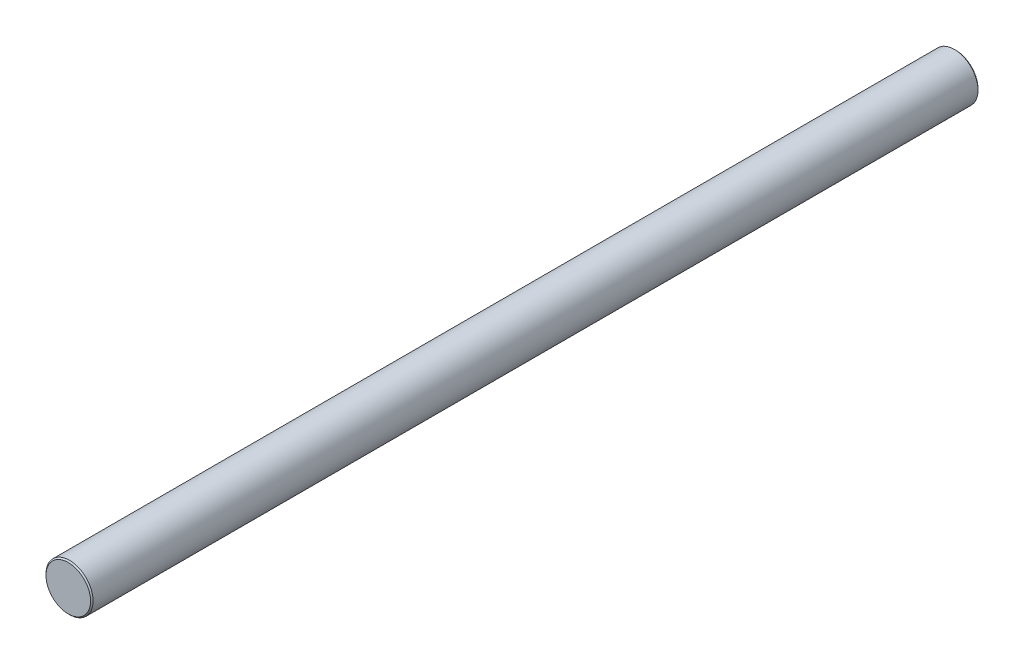
ISO-10303-21;
HEADER;
FILE_DESCRIPTION(('STEP AP214'),'2;1');
FILE_NAME('part.step','',(''),(''),'','','');
FILE_SCHEMA(('AUTOMOTIVE_DESIGN { 1 0 10303 214 1 1 1 1 }'));
ENDSEC;
DATA;
#1=APPLICATION_CONTEXT('core data for automotive mechanical design processes');
#2=APPLICATION_PROTOCOL_DEFINITION('international standard','automotive_design',2000,#1);
#3=PRODUCT_CONTEXT('',#1,'mechanical');
#4=PRODUCT('Part','Part','',(#3));
#5=PRODUCT_RELATED_PRODUCT_CATEGORY('part','',(#4));
#6=PRODUCT_DEFINITION_FORMATION('','',#4);
#7=PRODUCT_DEFINITION_CONTEXT('part definition',#1,'design');
#8=PRODUCT_DEFINITION('design','',#6,#7);
#9=PRODUCT_DEFINITION_SHAPE('','',#8);
#10=(LENGTH_UNIT() NAMED_UNIT(*) SI_UNIT(.MILLI.,.METRE.));
#11=(NAMED_UNIT(*) PLANE_ANGLE_UNIT() SI_UNIT($,.RADIAN.));
#12=(NAMED_UNIT(*) SI_UNIT($,.STERADIAN.) SOLID_ANGLE_UNIT());
#13=UNCERTAINTY_MEASURE_WITH_UNIT(LENGTH_MEASURE(1.E-05),#10,'distance_accuracy_value','');
#14=(GEOMETRIC_REPRESENTATION_CONTEXT(3) GLOBAL_UNCERTAINTY_ASSIGNED_CONTEXT((#13)) GLOBAL_UNIT_ASSIGNED_CONTEXT((#10,
#11,#12)) REPRESENTATION_CONTEXT('',''));
#15=CARTESIAN_POINT('',(0.,0.,0.));
#16=DIRECTION('',(0.,0.,1.));
#17=DIRECTION('',(1.,0.,0.));
#18=AXIS2_PLACEMENT_3D('',#15,#16,#17);
#19=CARTESIAN_POINT('',(0.,0.,179.5526));
#20=DIRECTION('',(0.,0.,-0.999999999999999));
#21=DIRECTION('',(-1.,0.,0.));
#22=AXIS2_PLACEMENT_3D('',#19,#20,#21);
#23=CYLINDRICAL_SURFACE('',#22,4.7625);
#24=CARTESIAN_POINT('',(0.,0.,179.2986));
#25=DIRECTION('',(0.,0.,0.999999999999999));
#26=DIRECTION('',(1.,0.,0.));
#27=AXIS2_PLACEMENT_3D('',#24,#25,#26);
#28=CIRCLE('',#27,4.7625);
#29=CARTESIAN_POINT('',(-4.7625,0.,179.2986));
#30=VERTEX_POINT('',#29);
#31=EDGE_CURVE('E41',#30,#30,#28,.F.);
#32=CARTESIAN_POINT('',(0.,0.,0.254000000000004));
#33=DIRECTION('',(0.,0.,0.999999999999999));
#34=DIRECTION('',(1.,0.,0.));
#35=AXIS2_PLACEMENT_3D('',#32,#33,#34);
#36=CIRCLE('',#35,4.7625);
#37=CARTESIAN_POINT('',(-4.7625,0.,0.254000000000004));
#38=VERTEX_POINT('',#37);
#39=EDGE_CURVE('E45',#38,#38,#36,.T.);
#40=CARTESIAN_POINT('',(-4.7625,0.,179.2986));
#41=CARTESIAN_POINT('',(-4.7625,0.,177.433552083333));
#42=CARTESIAN_POINT('',(-4.7625,0.,175.568504166666));
#43=CARTESIAN_POINT('',(-4.7625,0.,171.838408333333));
#44=CARTESIAN_POINT('',(-4.7625,0.,169.973360416666));
#45=CARTESIAN_POINT('',(-4.7625,0.,166.243264583333));
#46=CARTESIAN_POINT('',(-4.7625,0.,164.378216666666));
#47=CARTESIAN_POINT('',(-4.7625,0.,160.648120833333));
#48=CARTESIAN_POINT('',(-4.7625,0.,158.783072916666));
#49=CARTESIAN_POINT('',(-4.7625,0.,155.052977083333));
#50=CARTESIAN_POINT('',(-4.7625,0.,153.187929166666));
#51=CARTESIAN_POINT('',(-4.7625,0.,149.457833333333));
#52=CARTESIAN_POINT('',(-4.7625,0.,147.592785416666));
#53=CARTESIAN_POINT('',(-4.7625,0.,143.862689583333));
#54=CARTESIAN_POINT('',(-4.7625,0.,141.997641666666));
#55=CARTESIAN_POINT('',(-4.7625,0.,138.267545833333));
#56=CARTESIAN_POINT('',(-4.7625,0.,136.402497916666));
#57=CARTESIAN_POINT('',(-4.7625,0.,132.672402083333));
#58=CARTESIAN_POINT('',(-4.7625,0.,130.807354166666));
#59=CARTESIAN_POINT('',(-4.7625,0.,127.077258333333));
#60=CARTESIAN_POINT('',(-4.7625,0.,125.212210416666));
#61=CARTESIAN_POINT('',(-4.7625,0.,121.482114583333));
#62=CARTESIAN_POINT('',(-4.7625,0.,119.617066666666));
#63=CARTESIAN_POINT('',(-4.7625,0.,115.886970833333));
#64=CARTESIAN_POINT('',(-4.7625,0.,114.021922916666));
#65=CARTESIAN_POINT('',(-4.7625,0.,110.291827083333));
#66=CARTESIAN_POINT('',(-4.7625,0.,108.426779166666));
#67=CARTESIAN_POINT('',(-4.7625,0.,104.696683333333));
#68=CARTESIAN_POINT('',(-4.7625,0.,102.831635416666));
#69=CARTESIAN_POINT('',(-4.7625,0.,99.1015395833331));
#70=CARTESIAN_POINT('',(-4.7625,0.,97.2364916666665));
#71=CARTESIAN_POINT('',(-4.7625,0.,93.5063958333331));
#72=CARTESIAN_POINT('',(-4.7625,0.,91.6413479166665));
#73=CARTESIAN_POINT('',(-4.7625,0.,87.9112520833332));
#74=CARTESIAN_POINT('',(-4.7625,0.,86.0462041666665));
#75=CARTESIAN_POINT('',(-4.7625,0.,82.3161083333332));
#76=CARTESIAN_POINT('',(-4.7625,0.,80.4510604166665));
#77=CARTESIAN_POINT('',(-4.7625,0.,76.7209645833332));
#78=CARTESIAN_POINT('',(-4.7625,0.,74.8559166666665));
#79=CARTESIAN_POINT('',(-4.7625,0.,71.1258208333332));
#80=CARTESIAN_POINT('',(-4.7625,0.,69.2607729166665));
#81=CARTESIAN_POINT('',(-4.7625,0.,65.5306770833332));
#82=CARTESIAN_POINT('',(-4.7625,0.,63.6656291666665));
#83=CARTESIAN_POINT('',(-4.7625,0.,59.9355333333332));
#84=CARTESIAN_POINT('',(-4.7625,0.,58.0704854166665));
#85=CARTESIAN_POINT('',(-4.7625,0.,54.3403895833332));
#86=CARTESIAN_POINT('',(-4.7625,0.,52.4753416666665));
#87=CARTESIAN_POINT('',(-4.7625,0.,48.7452458333332));
#88=CARTESIAN_POINT('',(-4.7625,0.,46.8801979166666));
#89=CARTESIAN_POINT('',(-4.7625,0.,43.1501020833332));
#90=CARTESIAN_POINT('',(-4.7625,0.,41.2850541666666));
#91=CARTESIAN_POINT('',(-4.7625,0.,37.5549583333332));
#92=CARTESIAN_POINT('',(-4.7625,0.,35.6899104166666));
#93=CARTESIAN_POINT('',(-4.7625,0.,31.9598145833333));
#94=CARTESIAN_POINT('',(-4.7625,0.,30.0947666666666));
#95=CARTESIAN_POINT('',(-4.7625,0.,26.3646708333333));
#96=CARTESIAN_POINT('',(-4.7625,0.,24.4996229166666));
#97=CARTESIAN_POINT('',(-4.7625,0.,20.7695270833333));
#98=CARTESIAN_POINT('',(-4.7625,0.,18.9044791666666));
#99=CARTESIAN_POINT('',(-4.7625,0.,15.1743833333333));
#100=CARTESIAN_POINT('',(-4.7625,0.,13.3093354166666));
#101=CARTESIAN_POINT('',(-4.7625,0.,9.5792395833333));
#102=CARTESIAN_POINT('',(-4.7625,0.,7.71419166666664));
#103=CARTESIAN_POINT('',(-4.7625,0.,3.98409583333332));
#104=CARTESIAN_POINT('',(-4.7625,0.,2.11904791666666));
#105=CARTESIAN_POINT('',(-4.7625,0.,0.254000000000004));
#106=B_SPLINE_CURVE_WITH_KNOTS('',3,(#40,#41,#42,#43,#44,#45,#46,#47,#48,#49,#50,#51,#52,#53,
#54,#55,#56,#57,#58,#59,#60,#61,#62,#63,#64,#65,#66,#67,#68,#69,#70,#71,#72,#73,#74,#75,#76,#77,
#78,#79,#80,#81,#82,#83,#84,#85,#86,#87,#88,#89,#90,#91,#92,#93,#94,#95,#96,#97,#98,#99,#100,
#101,#102,#103,#104,#105),.UNSPECIFIED.,.F.,.F.,(4,2,2,2,2,2,2,2,2,2,2,2,2,2,2,2,2,2,2,2,2,2,2,
2,2,2,2,2,2,2,2,2,4),(0.,5.59514375,11.1902875,16.78543125,22.380575,27.97571875,
33.5708624999999,39.1660062499999,44.7611499999999,50.3562937499999,55.9514374999999,
61.5465812499999,67.1417249999999,72.7368687499999,78.3320124999998,83.9271562499998,
89.5222999999998,95.1174437499998,100.7125875,106.30773125,111.902875,117.49801875,123.0931625,
128.68830625,134.28345,139.87859375,145.4737375,151.06888125,156.664025,162.25916875,
167.8543125,173.44945625,179.0446),.UNSPECIFIED.);
#107=EDGE_CURVE('BSEAM34',#30,#38,#106,.T.);
#108=ORIENTED_EDGE('',*,*,#31,.T.);
#109=ORIENTED_EDGE('',*,*,#39,.T.);
#110=ORIENTED_EDGE('',*,*,#107,.T.);
#111=ORIENTED_EDGE('',*,*,#107,.F.);
#112=EDGE_LOOP('',(#108,#110,#109,#111));
#113=FACE_BOUND('',#112,.T.);
#114=ADVANCED_FACE('F34',(#113),#23,.T.);
#115=CARTESIAN_POINT('',(0.,0.,179.5526));
#116=DIRECTION('',(0.,0.,0.999999999999999));
#117=DIRECTION('',(1.,0.,0.));
#118=AXIS2_PLACEMENT_3D('',#115,#116,#117);
#119=PLANE('',#118);
#120=CARTESIAN_POINT('',(0.,0.,179.5526));
#121=DIRECTION('',(0.,0.,0.999999999999999));
#122=DIRECTION('',(1.,0.,0.));
#123=AXIS2_PLACEMENT_3D('',#120,#121,#122);
#124=CIRCLE('',#123,4.50850000000003);
#125=CARTESIAN_POINT('',(-4.50850000000004,0.,179.5526));
#126=VERTEX_POINT('',#125);
#127=EDGE_CURVE('E49',#126,#126,#124,.T.);
#128=ORIENTED_EDGE('',*,*,#127,.T.);
#129=EDGE_LOOP('',(#128));
#130=FACE_BOUND('',#129,.T.);
#131=ADVANCED_FACE('F55',(#130),#119,.T.);
#132=CARTESIAN_POINT('',(0.,0.,0.));
#133=DIRECTION('',(0.,0.,0.999999999999999));
#134=DIRECTION('',(1.,0.,0.));
#135=AXIS2_PLACEMENT_3D('',#132,#133,#134);
#136=PLANE('',#135);
#137=CARTESIAN_POINT('',(0.,0.,0.));
#138=DIRECTION('',(0.,0.,0.999999999999999));
#139=DIRECTION('',(1.,0.,0.));
#140=AXIS2_PLACEMENT_3D('',#137,#138,#139);
#141=CIRCLE('',#140,4.50849999999997);
#142=CARTESIAN_POINT('',(4.50849999999997,0.,0.));
#143=VERTEX_POINT('',#142);
#144=EDGE_CURVE('E10',#143,#143,#141,.F.);
#145=ORIENTED_EDGE('',*,*,#144,.T.);
#146=EDGE_LOOP('',(#145));
#147=FACE_BOUND('',#146,.T.);
#148=ADVANCED_FACE('F59',(#147),#136,.F.);
#149=CARTESIAN_POINT('',(0.,0.,179.5526));
#150=DIRECTION('',(0.,0.,-0.999999999999999));
#151=DIRECTION('',(-1.,0.,0.));
#152=AXIS2_PLACEMENT_3D('',#149,#150,#151);
#153=CONICAL_SURFACE('',#152,4.50850000000003,0.785398163397389);
#154=CARTESIAN_POINT('',(-4.76250000000004,0.,179.2986));
#155=CARTESIAN_POINT('',(-4.75985416666671,0.,179.301245833333));
#156=CARTESIAN_POINT('',(-4.75720833333337,0.,179.303891666666));
#157=CARTESIAN_POINT('',(-4.75191666666671,0.,179.309183333333));
#158=CARTESIAN_POINT('',(-4.74927083333337,0.,179.311829166666));
#159=CARTESIAN_POINT('',(-4.74397916666671,0.,179.317120833333));
#160=CARTESIAN_POINT('',(-4.74133333333338,0.,179.319766666666));
#161=CARTESIAN_POINT('',(-4.73604166666671,0.,179.325058333333));
#162=CARTESIAN_POINT('',(-4.73339583333338,0.,179.327704166666));
#163=CARTESIAN_POINT('',(-4.72810416666671,0.,179.332995833333));
#164=CARTESIAN_POINT('',(-4.72545833333337,0.,179.335641666666));
#165=CARTESIAN_POINT('',(-4.72016666666671,0.,179.340933333333));
#166=CARTESIAN_POINT('',(-4.71752083333338,0.,179.343579166666));
#167=CARTESIAN_POINT('',(-4.71222916666671,0.,179.348870833333));
#168=CARTESIAN_POINT('',(-4.70958333333337,0.,179.351516666666));
#169=CARTESIAN_POINT('',(-4.70429166666671,0.,179.356808333333));
#170=CARTESIAN_POINT('',(-4.70164583333337,0.,179.359454166666));
#171=CARTESIAN_POINT('',(-4.69635416666671,0.,179.364745833333));
#172=CARTESIAN_POINT('',(-4.69370833333337,0.,179.367391666666));
#173=CARTESIAN_POINT('',(-4.68841666666671,0.,179.372683333333));
#174=CARTESIAN_POINT('',(-4.68577083333337,0.,179.375329166666));
#175=CARTESIAN_POINT('',(-4.68047916666671,0.,179.380620833333));
#176=CARTESIAN_POINT('',(-4.67783333333337,0.,179.383266666666));
#177=CARTESIAN_POINT('',(-4.67254166666671,0.,179.388558333333));
#178=CARTESIAN_POINT('',(-4.66989583333337,0.,179.391204166666));
#179=CARTESIAN_POINT('',(-4.66460416666671,0.,179.396495833333));
#180=CARTESIAN_POINT('',(-4.66195833333337,0.,179.399141666666));
#181=CARTESIAN_POINT('',(-4.65666666666671,0.,179.404433333333));
#182=CARTESIAN_POINT('',(-4.65402083333337,0.,179.407079166666));
#183=CARTESIAN_POINT('',(-4.64872916666671,0.,179.412370833333));
#184=CARTESIAN_POINT('',(-4.64608333333338,0.,179.415016666666));
#185=CARTESIAN_POINT('',(-4.64079166666671,0.,179.420308333333));
#186=CARTESIAN_POINT('',(-4.63814583333337,0.,179.422954166666));
#187=CARTESIAN_POINT('',(-4.63285416666671,0.,179.428245833333));
#188=CARTESIAN_POINT('',(-4.63020833333338,0.,179.430891666666));
#189=CARTESIAN_POINT('',(-4.62491666666671,0.,179.436183333333));
#190=CARTESIAN_POINT('',(-4.62227083333338,0.,179.438829166666));
#191=CARTESIAN_POINT('',(-4.61697916666671,0.,179.444120833333));
#192=CARTESIAN_POINT('',(-4.61433333333337,0.,179.446766666666));
#193=CARTESIAN_POINT('',(-4.60904166666671,0.,179.452058333333));
#194=CARTESIAN_POINT('',(-4.60639583333337,0.,179.454704166666));
#195=CARTESIAN_POINT('',(-4.60110416666671,0.,179.459995833333));
#196=CARTESIAN_POINT('',(-4.59845833333337,0.,179.462641666666));
#197=CARTESIAN_POINT('',(-4.59316666666671,0.,179.467933333333));
#198=CARTESIAN_POINT('',(-4.59052083333337,0.,179.470579166666));
#199=CARTESIAN_POINT('',(-4.58522916666671,0.,179.475870833333));
#200=CARTESIAN_POINT('',(-4.58258333333337,0.,179.478516666666));
#201=CARTESIAN_POINT('',(-4.57729166666671,0.,179.483808333333));
#202=CARTESIAN_POINT('',(-4.57464583333337,0.,179.486454166666));
#203=CARTESIAN_POINT('',(-4.56935416666671,0.,179.491745833333));
#204=CARTESIAN_POINT('',(-4.56670833333337,0.,179.494391666666));
#205=CARTESIAN_POINT('',(-4.56141666666671,0.,179.499683333333));
#206=CARTESIAN_POINT('',(-4.55877083333337,0.,179.502329166666));
#207=CARTESIAN_POINT('',(-4.55347916666671,0.,179.507620833333));
#208=CARTESIAN_POINT('',(-4.55083333333337,0.,179.510266666666));
#209=CARTESIAN_POINT('',(-4.54554166666671,0.,179.515558333333));
#210=CARTESIAN_POINT('',(-4.54289583333337,0.,179.518204166666));
#211=CARTESIAN_POINT('',(-4.53760416666671,0.,179.523495833333));
#212=CARTESIAN_POINT('',(-4.53495833333337,0.,179.526141666666));
#213=CARTESIAN_POINT('',(-4.52966666666671,0.,179.531433333333));
#214=CARTESIAN_POINT('',(-4.52702083333337,0.,179.534079166666));
#215=CARTESIAN_POINT('',(-4.52172916666671,0.,179.539370833333));
#216=CARTESIAN_POINT('',(-4.51908333333337,0.,179.542016666666));
#217=CARTESIAN_POINT('',(-4.5137916666667,0.,179.547308333333));
#218=CARTESIAN_POINT('',(-4.51114583333337,0.,179.549954166666));
#219=CARTESIAN_POINT('',(-4.50850000000004,0.,179.5526));
#220=B_SPLINE_CURVE_WITH_KNOTS('',3,(#154,#155,#156,#157,#158,#159,#160,#161,#162,#163,#164,
#165,#166,#167,#168,#169,#170,#171,#172,#173,#174,#175,#176,#177,#178,#179,#180,#181,#182,#183,
#184,#185,#186,#187,#188,#189,#190,#191,#192,#193,#194,#195,#196,#197,#198,#199,#200,#201,#202,
#203,#204,#205,#206,#207,#208,#209,#210,#211,#212,#213,#214,#215,#216,#217,#218,#219),
.UNSPECIFIED.,.F.,.F.,(4,2,2,2,2,2,2,2,2,2,2,2,2,2,2,2,2,2,2,2,2,2,2,2,2,2,2,2,2,2,2,2,4),(0.,
0.011225320151336,0.0224506403026714,0.0336759604540074,0.0449012806053434,0.0561266007566795,
0.0673519209080155,0.0785772410593515,0.0898025612106875,0.101027881362024,0.11225320151336,
0.123478521664696,0.134703841816032,0.145929161967368,0.157154482118703,0.168379802270039,
0.179605122421375,0.190830442572731,0.202055762724067,0.213281082875403,0.224506403026739,
0.235731723178075,0.246957043329411,0.258182363480747,0.269407683632083,0.280633003783419,
0.291858323934754,0.30308364408609,0.314308964237426,0.325534284388762,0.336759604540098,
0.347984924691434,0.35921024484279),.UNSPECIFIED.);
#221=EDGE_CURVE('BSEAM57',#30,#126,#220,.T.);
#222=ORIENTED_EDGE('',*,*,#31,.F.);
#223=ORIENTED_EDGE('',*,*,#127,.F.);
#224=ORIENTED_EDGE('',*,*,#221,.T.);
#225=ORIENTED_EDGE('',*,*,#221,.F.);
#226=EDGE_LOOP('',(#222,#224,#223,#225));
#227=FACE_BOUND('',#226,.T.);
#228=ADVANCED_FACE('F57',(#227),#153,.T.);
#229=CARTESIAN_POINT('',(0.,0.,0.254000000000004));
#230=DIRECTION('',(0.,0.,0.999999999999999));
#231=DIRECTION('',(1.,0.,0.));
#232=AXIS2_PLACEMENT_3D('',#229,#230,#231);
#233=CONICAL_SURFACE('',#232,4.7625,0.785398163397498);
#234=ORIENTED_EDGE('',*,*,#144,.F.);
#235=EDGE_LOOP('',(#234));
#236=FACE_BOUND('',#235,.T.);
#237=ORIENTED_EDGE('',*,*,#39,.F.);
#238=EDGE_LOOP('',(#237));
#239=FACE_BOUND('',#238,.T.);
#240=ADVANCED_FACE('F36',(#236,#239),#233,.T.);
#241=CLOSED_SHELL('',(#114,#131,#148,#228,#240));
#242=MANIFOLD_SOLID_BREP('B2',#241);
#243=ADVANCED_BREP_SHAPE_REPRESENTATION('',(#18,#242),#14);
#244=SHAPE_DEFINITION_REPRESENTATION(#9,#243);
ENDSEC;
END-ISO-10303-21;
